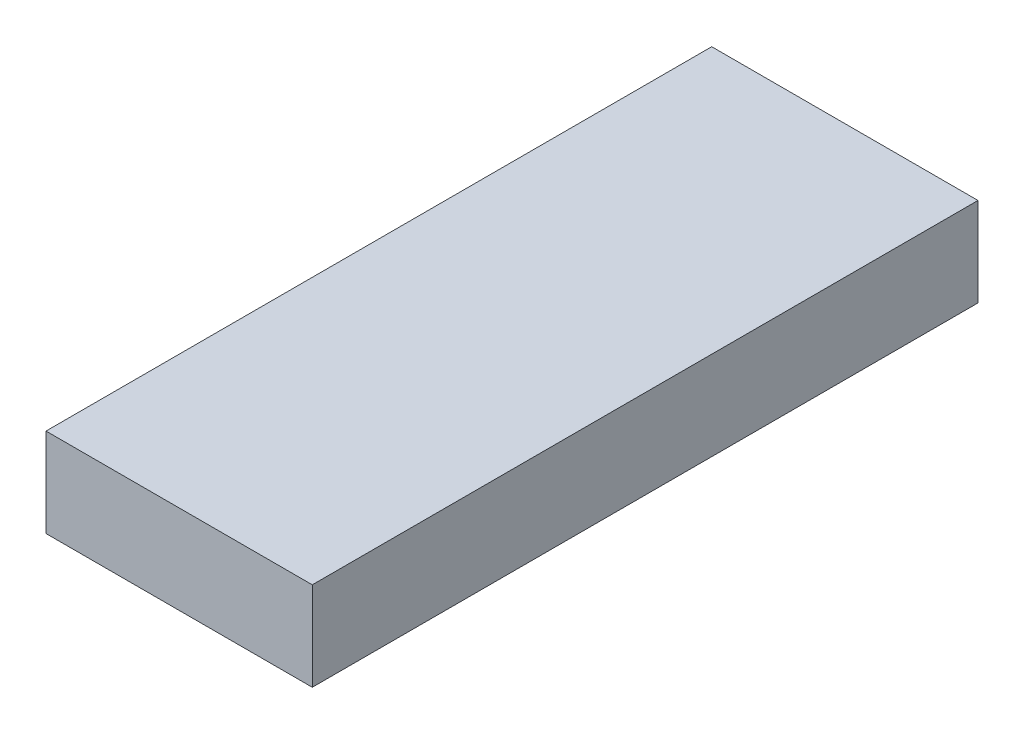
ISO-10303-21;
HEADER;
FILE_DESCRIPTION(('STEP AP214'),'2;1');
FILE_NAME('part.step','',(''),(''),'','','');
FILE_SCHEMA(('AUTOMOTIVE_DESIGN { 1 0 10303 214 1 1 1 1 }'));
ENDSEC;
DATA;
#1=APPLICATION_CONTEXT('core data for automotive mechanical design processes');
#2=APPLICATION_PROTOCOL_DEFINITION('international standard','automotive_design',2000,#1);
#3=PRODUCT_CONTEXT('',#1,'mechanical');
#4=PRODUCT('Part','Part','',(#3));
#5=PRODUCT_RELATED_PRODUCT_CATEGORY('part','',(#4));
#6=PRODUCT_DEFINITION_FORMATION('','',#4);
#7=PRODUCT_DEFINITION_CONTEXT('part definition',#1,'design');
#8=PRODUCT_DEFINITION('design','',#6,#7);
#9=PRODUCT_DEFINITION_SHAPE('','',#8);
#10=(LENGTH_UNIT() NAMED_UNIT(*) SI_UNIT(.MILLI.,.METRE.));
#11=(NAMED_UNIT(*) PLANE_ANGLE_UNIT() SI_UNIT($,.RADIAN.));
#12=(NAMED_UNIT(*) SI_UNIT($,.STERADIAN.) SOLID_ANGLE_UNIT());
#13=UNCERTAINTY_MEASURE_WITH_UNIT(LENGTH_MEASURE(1.E-05),#10,'distance_accuracy_value','');
#14=(GEOMETRIC_REPRESENTATION_CONTEXT(3) GLOBAL_UNCERTAINTY_ASSIGNED_CONTEXT((#13)) GLOBAL_UNIT_ASSIGNED_CONTEXT((#10,
#11,#12)) REPRESENTATION_CONTEXT('',''));
#15=CARTESIAN_POINT('',(0.,0.,0.));
#16=DIRECTION('',(0.,0.,1.));
#17=DIRECTION('',(1.,0.,0.));
#18=AXIS2_PLACEMENT_3D('',#15,#16,#17);
#19=CARTESIAN_POINT('',(1.3,1.3,0.));
#20=DIRECTION('',(1.,0.,0.));
#21=DIRECTION('',(0.,0.,-1.));
#22=AXIS2_PLACEMENT_3D('',#19,#20,#21);
#23=PLANE('',#22);
#24=DIRECTION('',(0.,0.,1.));
#25=VECTOR('',#24,1.);
#26=CARTESIAN_POINT('',(1.3,0.,0.));
#27=LINE('',#26,#25);
#28=CARTESIAN_POINT('',(1.3,0.,-4.8));
#29=VERTEX_POINT('',#28);
#30=CARTESIAN_POINT('',(1.3,0.,4.8));
#31=VERTEX_POINT('',#30);
#32=EDGE_CURVE('E155',#29,#31,#27,.T.);
#33=ORIENTED_EDGE('',*,*,#32,.F.);
#34=DIRECTION('',(0.,-1.,0.));
#35=VECTOR('',#34,1.);
#36=CARTESIAN_POINT('',(1.3,1.3,-4.8));
#37=LINE('',#36,#35);
#38=CARTESIAN_POINT('',(1.3,1.3,-4.8));
#39=VERTEX_POINT('',#38);
#40=EDGE_CURVE('E11',#39,#29,#37,.T.);
#41=ORIENTED_EDGE('',*,*,#40,.F.);
#42=DIRECTION('',(0.,0.,1.));
#43=VECTOR('',#42,1.);
#44=CARTESIAN_POINT('',(1.3,1.3,0.));
#45=LINE('',#44,#43);
#46=CARTESIAN_POINT('',(1.3,1.3,4.8));
#47=VERTEX_POINT('',#46);
#48=EDGE_CURVE('E162',#39,#47,#45,.T.);
#49=ORIENTED_EDGE('',*,*,#48,.T.);
#50=DIRECTION('',(0.,-1.,0.));
#51=VECTOR('',#50,1.);
#52=CARTESIAN_POINT('',(1.3,1.3,4.8));
#53=LINE('',#52,#51);
#54=EDGE_CURVE('E76',#47,#31,#53,.T.);
#55=ORIENTED_EDGE('',*,*,#54,.T.);
#56=EDGE_LOOP('',(#33,#41,#49,#55));
#57=FACE_BOUND('',#56,.T.);
#58=ADVANCED_FACE('F39',(#57),#23,.T.);
#59=CARTESIAN_POINT('',(0.,1.3,-4.8));
#60=DIRECTION('',(0.,0.,-1.));
#61=DIRECTION('',(-1.,0.,0.));
#62=AXIS2_PLACEMENT_3D('',#59,#60,#61);
#63=PLANE('',#62);
#64=DIRECTION('',(1.,0.,0.));
#65=VECTOR('',#64,1.);
#66=CARTESIAN_POINT('',(0.,0.,-4.8));
#67=LINE('',#66,#65);
#68=CARTESIAN_POINT('',(-1.3,0.,-4.8));
#69=VERTEX_POINT('',#68);
#70=EDGE_CURVE('E180',#69,#29,#67,.T.);
#71=ORIENTED_EDGE('',*,*,#70,.F.);
#72=DIRECTION('',(0.,-1.,0.));
#73=VECTOR('',#72,1.);
#74=CARTESIAN_POINT('',(-1.3,1.3,-4.8));
#75=LINE('',#74,#73);
#76=CARTESIAN_POINT('',(-1.3,1.3,-4.8));
#77=VERTEX_POINT('',#76);
#78=EDGE_CURVE('E48',#77,#69,#75,.T.);
#79=ORIENTED_EDGE('',*,*,#78,.F.);
#80=DIRECTION('',(1.,0.,0.));
#81=VECTOR('',#80,1.);
#82=CARTESIAN_POINT('',(0.,1.3,-4.8));
#83=LINE('',#82,#81);
#84=EDGE_CURVE('E165',#77,#39,#83,.T.);
#85=ORIENTED_EDGE('',*,*,#84,.T.);
#86=ORIENTED_EDGE('',*,*,#40,.T.);
#87=EDGE_LOOP('',(#71,#79,#85,#86));
#88=FACE_BOUND('',#87,.T.);
#89=ADVANCED_FACE('F199',(#88),#63,.T.);
#90=CARTESIAN_POINT('',(-1.3,1.3,0.));
#91=DIRECTION('',(1.,0.,0.));
#92=DIRECTION('',(0.,0.,-1.));
#93=AXIS2_PLACEMENT_3D('',#90,#91,#92);
#94=PLANE('',#93);
#95=DIRECTION('',(0.,0.,1.));
#96=VECTOR('',#95,1.);
#97=CARTESIAN_POINT('',(-1.3,0.,0.));
#98=LINE('',#97,#96);
#99=CARTESIAN_POINT('',(-1.3,0.,4.8));
#100=VERTEX_POINT('',#99);
#101=EDGE_CURVE('E70',#69,#100,#98,.T.);
#102=ORIENTED_EDGE('',*,*,#101,.T.);
#103=DIRECTION('',(0.,-1.,0.));
#104=VECTOR('',#103,1.);
#105=CARTESIAN_POINT('',(-1.3,1.3,4.8));
#106=LINE('',#105,#104);
#107=CARTESIAN_POINT('',(-1.3,1.3,4.8));
#108=VERTEX_POINT('',#107);
#109=EDGE_CURVE('E56',#108,#100,#106,.T.);
#110=ORIENTED_EDGE('',*,*,#109,.F.);
#111=DIRECTION('',(0.,0.,1.));
#112=VECTOR('',#111,1.);
#113=CARTESIAN_POINT('',(-1.3,1.3,0.));
#114=LINE('',#113,#112);
#115=EDGE_CURVE('E169',#77,#108,#114,.T.);
#116=ORIENTED_EDGE('',*,*,#115,.F.);
#117=ORIENTED_EDGE('',*,*,#78,.T.);
#118=EDGE_LOOP('',(#102,#110,#116,#117));
#119=FACE_BOUND('',#118,.T.);
#120=ADVANCED_FACE('F192',(#119),#94,.F.);
#121=CARTESIAN_POINT('',(0.,1.3,4.8));
#122=DIRECTION('',(0.,0.,-1.));
#123=DIRECTION('',(-1.,0.,0.));
#124=AXIS2_PLACEMENT_3D('',#121,#122,#123);
#125=PLANE('',#124);
#126=DIRECTION('',(1.,0.,0.));
#127=VECTOR('',#126,1.);
#128=CARTESIAN_POINT('',(0.,0.,4.8));
#129=LINE('',#128,#127);
#130=EDGE_CURVE('E166',#100,#31,#129,.T.);
#131=ORIENTED_EDGE('',*,*,#130,.T.);
#132=ORIENTED_EDGE('',*,*,#54,.F.);
#133=DIRECTION('',(1.,0.,0.));
#134=VECTOR('',#133,1.);
#135=CARTESIAN_POINT('',(0.,1.3,4.8));
#136=LINE('',#135,#134);
#137=EDGE_CURVE('E173',#108,#47,#136,.T.);
#138=ORIENTED_EDGE('',*,*,#137,.F.);
#139=ORIENTED_EDGE('',*,*,#109,.T.);
#140=EDGE_LOOP('',(#131,#132,#138,#139));
#141=FACE_BOUND('',#140,.T.);
#142=ADVANCED_FACE('F208',(#141),#125,.F.);
#143=CARTESIAN_POINT('',(0.,0.,0.));
#144=DIRECTION('',(0.,1.,0.));
#145=DIRECTION('',(0.,0.,1.));
#146=AXIS2_PLACEMENT_3D('',#143,#144,#145);
#147=PLANE('',#146);
#148=ORIENTED_EDGE('',*,*,#32,.T.);
#149=ORIENTED_EDGE('',*,*,#130,.F.);
#150=ORIENTED_EDGE('',*,*,#101,.F.);
#151=ORIENTED_EDGE('',*,*,#70,.T.);
#152=EDGE_LOOP('',(#148,#149,#150,#151));
#153=FACE_BOUND('',#152,.T.);
#154=ADVANCED_FACE('F198',(#153),#147,.F.);
#155=CARTESIAN_POINT('',(0.,1.3,0.));
#156=DIRECTION('',(0.,-1.,0.));
#157=DIRECTION('',(0.,0.,-1.));
#158=AXIS2_PLACEMENT_3D('',#155,#156,#157);
#159=PLANE('',#158);
#160=DIRECTION('',(-1.,0.,0.));
#161=VECTOR('',#160,1.);
#162=CARTESIAN_POINT('',(0.,1.3,7.5));
#163=LINE('',#162,#161);
#164=CARTESIAN_POINT('',(3.,1.3,7.5));
#165=VERTEX_POINT('',#164);
#166=CARTESIAN_POINT('',(-3.,1.3,7.5));
#167=VERTEX_POINT('',#166);
#168=EDGE_CURVE('E145',#165,#167,#163,.T.);
#169=ORIENTED_EDGE('',*,*,#168,.T.);
#170=DIRECTION('',(0.,0.,-1.));
#171=VECTOR('',#170,1.);
#172=CARTESIAN_POINT('',(-3.,1.3,0.));
#173=LINE('',#172,#171);
#174=CARTESIAN_POINT('',(-3.,1.3,-7.5));
#175=VERTEX_POINT('',#174);
#176=EDGE_CURVE('E113',#167,#175,#173,.T.);
#177=ORIENTED_EDGE('',*,*,#176,.T.);
#178=DIRECTION('',(-1.,0.,0.));
#179=VECTOR('',#178,1.);
#180=CARTESIAN_POINT('',(0.,1.3,-7.5));
#181=LINE('',#180,#179);
#182=CARTESIAN_POINT('',(3.,1.3,-7.5));
#183=VERTEX_POINT('',#182);
#184=EDGE_CURVE('E138',#183,#175,#181,.T.);
#185=ORIENTED_EDGE('',*,*,#184,.F.);
#186=DIRECTION('',(0.,0.,-1.));
#187=VECTOR('',#186,1.);
#188=CARTESIAN_POINT('',(3.,1.3,0.));
#189=LINE('',#188,#187);
#190=EDGE_CURVE('E135',#165,#183,#189,.T.);
#191=ORIENTED_EDGE('',*,*,#190,.F.);
#192=EDGE_LOOP('',(#169,#177,#185,#191));
#193=FACE_BOUND('',#192,.T.);
#194=ORIENTED_EDGE('',*,*,#48,.F.);
#195=ORIENTED_EDGE('',*,*,#84,.F.);
#196=ORIENTED_EDGE('',*,*,#115,.T.);
#197=ORIENTED_EDGE('',*,*,#137,.T.);
#198=EDGE_LOOP('',(#194,#195,#196,#197));
#199=FACE_BOUND('',#198,.T.);
#200=ADVANCED_FACE('F216',(#193,#199),#159,.T.);
#201=CARTESIAN_POINT('',(0.,3.3,7.5));
#202=DIRECTION('',(0.,0.,1.));
#203=DIRECTION('',(1.,0.,0.));
#204=AXIS2_PLACEMENT_3D('',#201,#202,#203);
#205=PLANE('',#204);
#206=ORIENTED_EDGE('',*,*,#168,.F.);
#207=DIRECTION('',(0.,-1.,0.));
#208=VECTOR('',#207,1.);
#209=CARTESIAN_POINT('',(3.,3.3,7.5));
#210=LINE('',#209,#208);
#211=CARTESIAN_POINT('',(3.,3.3,7.5));
#212=VERTEX_POINT('',#211);
#213=EDGE_CURVE('E132',#212,#165,#210,.T.);
#214=ORIENTED_EDGE('',*,*,#213,.F.);
#215=DIRECTION('',(-1.,0.,0.));
#216=VECTOR('',#215,1.);
#217=CARTESIAN_POINT('',(0.,3.3,7.5));
#218=LINE('',#217,#216);
#219=CARTESIAN_POINT('',(-3.,3.3,7.5));
#220=VERTEX_POINT('',#219);
#221=EDGE_CURVE('E125',#212,#220,#218,.T.);
#222=ORIENTED_EDGE('',*,*,#221,.T.);
#223=DIRECTION('',(0.,-1.,0.));
#224=VECTOR('',#223,1.);
#225=CARTESIAN_POINT('',(-3.,3.3,7.5));
#226=LINE('',#225,#224);
#227=EDGE_CURVE('E108',#220,#167,#226,.T.);
#228=ORIENTED_EDGE('',*,*,#227,.T.);
#229=EDGE_LOOP('',(#206,#214,#222,#228));
#230=FACE_BOUND('',#229,.T.);
#231=ADVANCED_FACE('F131',(#230),#205,.T.);
#232=CARTESIAN_POINT('',(3.,3.3,0.));
#233=DIRECTION('',(-1.,0.,0.));
#234=DIRECTION('',(0.,0.,1.));
#235=AXIS2_PLACEMENT_3D('',#232,#233,#234);
#236=PLANE('',#235);
#237=ORIENTED_EDGE('',*,*,#190,.T.);
#238=DIRECTION('',(0.,-1.,0.));
#239=VECTOR('',#238,1.);
#240=CARTESIAN_POINT('',(3.,3.3,-7.5));
#241=LINE('',#240,#239);
#242=CARTESIAN_POINT('',(3.,3.3,-7.5));
#243=VERTEX_POINT('',#242);
#244=EDGE_CURVE('E156',#243,#183,#241,.T.);
#245=ORIENTED_EDGE('',*,*,#244,.F.);
#246=DIRECTION('',(0.,0.,-1.));
#247=VECTOR('',#246,1.);
#248=CARTESIAN_POINT('',(3.,3.3,0.));
#249=LINE('',#248,#247);
#250=EDGE_CURVE('E120',#212,#243,#249,.T.);
#251=ORIENTED_EDGE('',*,*,#250,.F.);
#252=ORIENTED_EDGE('',*,*,#213,.T.);
#253=EDGE_LOOP('',(#237,#245,#251,#252));
#254=FACE_BOUND('',#253,.T.);
#255=ADVANCED_FACE('F219',(#254),#236,.F.);
#256=CARTESIAN_POINT('',(0.,3.3,-7.5));
#257=DIRECTION('',(0.,0.,1.));
#258=DIRECTION('',(1.,0.,0.));
#259=AXIS2_PLACEMENT_3D('',#256,#257,#258);
#260=PLANE('',#259);
#261=ORIENTED_EDGE('',*,*,#184,.T.);
#262=DIRECTION('',(0.,-1.,0.));
#263=VECTOR('',#262,1.);
#264=CARTESIAN_POINT('',(-3.,3.3,-7.5));
#265=LINE('',#264,#263);
#266=CARTESIAN_POINT('',(-3.,3.3,-7.5));
#267=VERTEX_POINT('',#266);
#268=EDGE_CURVE('E119',#267,#175,#265,.T.);
#269=ORIENTED_EDGE('',*,*,#268,.F.);
#270=DIRECTION('',(-1.,0.,0.));
#271=VECTOR('',#270,1.);
#272=CARTESIAN_POINT('',(0.,3.3,-7.5));
#273=LINE('',#272,#271);
#274=EDGE_CURVE('E127',#243,#267,#273,.T.);
#275=ORIENTED_EDGE('',*,*,#274,.F.);
#276=ORIENTED_EDGE('',*,*,#244,.T.);
#277=EDGE_LOOP('',(#261,#269,#275,#276));
#278=FACE_BOUND('',#277,.T.);
#279=ADVANCED_FACE('F222',(#278),#260,.F.);
#280=CARTESIAN_POINT('',(-3.,3.3,0.));
#281=DIRECTION('',(-1.,0.,0.));
#282=DIRECTION('',(0.,0.,1.));
#283=AXIS2_PLACEMENT_3D('',#280,#281,#282);
#284=PLANE('',#283);
#285=ORIENTED_EDGE('',*,*,#176,.F.);
#286=ORIENTED_EDGE('',*,*,#227,.F.);
#287=DIRECTION('',(0.,0.,-1.));
#288=VECTOR('',#287,1.);
#289=CARTESIAN_POINT('',(-3.,3.3,0.));
#290=LINE('',#289,#288);
#291=EDGE_CURVE('E111',#220,#267,#290,.T.);
#292=ORIENTED_EDGE('',*,*,#291,.T.);
#293=ORIENTED_EDGE('',*,*,#268,.T.);
#294=EDGE_LOOP('',(#285,#286,#292,#293));
#295=FACE_BOUND('',#294,.T.);
#296=ADVANCED_FACE('F110',(#295),#284,.T.);
#297=CARTESIAN_POINT('',(0.,3.3,0.));
#298=DIRECTION('',(0.,-1.,0.));
#299=DIRECTION('',(0.,0.,-1.));
#300=AXIS2_PLACEMENT_3D('',#297,#298,#299);
#301=PLANE('',#300);
#302=ORIENTED_EDGE('',*,*,#221,.F.);
#303=ORIENTED_EDGE('',*,*,#250,.T.);
#304=ORIENTED_EDGE('',*,*,#274,.T.);
#305=ORIENTED_EDGE('',*,*,#291,.F.);
#306=EDGE_LOOP('',(#302,#303,#304,#305));
#307=FACE_BOUND('',#306,.T.);
#308=ADVANCED_FACE('F124',(#307),#301,.F.);
#309=CLOSED_SHELL('',(#58,#89,#120,#142,#154,#200,#231,#255,#279,#296,#308));
#310=MANIFOLD_SOLID_BREP('B2',#309);
#311=ADVANCED_BREP_SHAPE_REPRESENTATION('',(#18,#310),#14);
#312=SHAPE_DEFINITION_REPRESENTATION(#9,#311);
ENDSEC;
END-ISO-10303-21;
